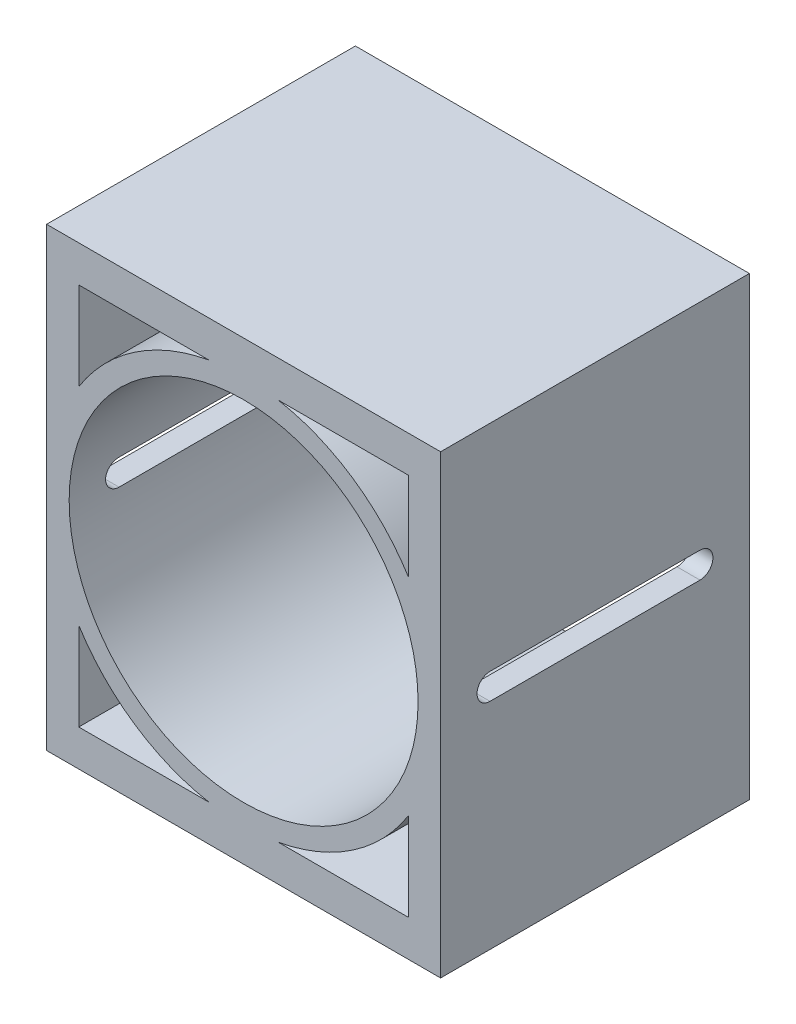
ISO-10303-21;
HEADER;
FILE_DESCRIPTION(('STEP AP214'),'2;1');
FILE_NAME('part.step','',(''),(''),'','','');
FILE_SCHEMA(('AUTOMOTIVE_DESIGN { 1 0 10303 214 1 1 1 1 }'));
ENDSEC;
DATA;
#1=APPLICATION_CONTEXT('core data for automotive mechanical design processes');
#2=APPLICATION_PROTOCOL_DEFINITION('international standard','automotive_design',2000,#1);
#3=PRODUCT_CONTEXT('',#1,'mechanical');
#4=PRODUCT('Part','Part','',(#3));
#5=PRODUCT_RELATED_PRODUCT_CATEGORY('part','',(#4));
#6=PRODUCT_DEFINITION_FORMATION('','',#4);
#7=PRODUCT_DEFINITION_CONTEXT('part definition',#1,'design');
#8=PRODUCT_DEFINITION('design','',#6,#7);
#9=PRODUCT_DEFINITION_SHAPE('','',#8);
#10=(LENGTH_UNIT() NAMED_UNIT(*) SI_UNIT(.MILLI.,.METRE.));
#11=(NAMED_UNIT(*) PLANE_ANGLE_UNIT() SI_UNIT($,.RADIAN.));
#12=(NAMED_UNIT(*) SI_UNIT($,.STERADIAN.) SOLID_ANGLE_UNIT());
#13=UNCERTAINTY_MEASURE_WITH_UNIT(LENGTH_MEASURE(1.E-05),#10,'distance_accuracy_value','');
#14=(GEOMETRIC_REPRESENTATION_CONTEXT(3) GLOBAL_UNCERTAINTY_ASSIGNED_CONTEXT((#13)) GLOBAL_UNIT_ASSIGNED_CONTEXT((#10,
#11,#12)) REPRESENTATION_CONTEXT('',''));
#15=CARTESIAN_POINT('',(0.,0.,0.));
#16=DIRECTION('',(0.,0.,1.));
#17=DIRECTION('',(1.,0.,0.));
#18=AXIS2_PLACEMENT_3D('',#15,#16,#17);
#19=CARTESIAN_POINT('',(0.,31.,10.));
#20=DIRECTION('',(0.,1.,0.));
#21=DIRECTION('',(0.,0.,1.));
#22=AXIS2_PLACEMENT_3D('',#19,#20,#21);
#23=PLANE('',#22);
#24=DIRECTION('',(1.,0.,0.));
#25=VECTOR('',#24,1.);
#26=CARTESIAN_POINT('',(0.,31.,0.));
#27=LINE('',#26,#25);
#28=CARTESIAN_POINT('',(-26.6944444444445,31.,0.));
#29=VERTEX_POINT('',#28);
#30=CARTESIAN_POINT('',(-5.59016994374946,31.,0.));
#31=VERTEX_POINT('',#30);
#32=EDGE_CURVE('E364',#29,#31,#27,.T.);
#33=ORIENTED_EDGE('',*,*,#32,.T.);
#34=DIRECTION('',(0.,0.,-1.));
#35=VECTOR('',#34,1.);
#36=CARTESIAN_POINT('',(-5.59016994374946,31.,10.));
#37=LINE('',#36,#35);
#38=CARTESIAN_POINT('',(-5.59016994374946,31.,50.));
#39=VERTEX_POINT('',#38);
#40=EDGE_CURVE('E384',#39,#31,#37,.T.);
#41=ORIENTED_EDGE('',*,*,#40,.F.);
#42=DIRECTION('',(-1.,0.,0.));
#43=VECTOR('',#42,1.);
#44=CARTESIAN_POINT('',(-26.6944444444445,31.,50.));
#45=LINE('',#44,#43);
#46=CARTESIAN_POINT('',(-26.6944444444445,31.,50.));
#47=VERTEX_POINT('',#46);
#48=EDGE_CURVE('E262',#39,#47,#45,.T.);
#49=ORIENTED_EDGE('',*,*,#48,.T.);
#50=DIRECTION('',(0.,0.,-1.));
#51=VECTOR('',#50,1.);
#52=CARTESIAN_POINT('',(-26.6944444444445,31.,10.));
#53=LINE('',#52,#51);
#54=EDGE_CURVE('E377',#47,#29,#53,.T.);
#55=ORIENTED_EDGE('',*,*,#54,.T.);
#56=EDGE_LOOP('',(#33,#41,#49,#55));
#57=FACE_BOUND('',#56,.T.);
#58=ADVANCED_FACE('F41',(#57),#23,.F.);
#59=CARTESIAN_POINT('',(0.,0.,10.));
#60=DIRECTION('',(0.,0.,-1.));
#61=DIRECTION('',(-1.,0.,0.));
#62=AXIS2_PLACEMENT_3D('',#59,#60,#61);
#63=CYLINDRICAL_SURFACE('',#62,31.5);
#64=CARTESIAN_POINT('',(0.,0.,0.));
#65=DIRECTION('',(0.,0.,1.));
#66=DIRECTION('',(1.,0.,0.));
#67=AXIS2_PLACEMENT_3D('',#64,#65,#66);
#68=CIRCLE('',#67,31.5);
#69=CARTESIAN_POINT('',(-26.6944444444445,16.7229374154922,0.));
#70=VERTEX_POINT('',#69);
#71=EDGE_CURVE('E368',#31,#70,#68,.T.);
#72=ORIENTED_EDGE('',*,*,#71,.T.);
#73=DIRECTION('',(0.,0.,-1.));
#74=VECTOR('',#73,1.);
#75=CARTESIAN_POINT('',(-26.6944444444445,16.7229374154922,10.));
#76=LINE('',#75,#74);
#77=CARTESIAN_POINT('',(-26.6944444444445,16.7229374154922,50.));
#78=VERTEX_POINT('',#77);
#79=EDGE_CURVE('E380',#78,#70,#76,.T.);
#80=ORIENTED_EDGE('',*,*,#79,.F.);
#81=CARTESIAN_POINT('',(0.,0.,50.));
#82=DIRECTION('',(0.,0.,-1.));
#83=DIRECTION('',(1.,0.,0.));
#84=AXIS2_PLACEMENT_3D('',#81,#82,#83);
#85=CIRCLE('',#84,31.5);
#86=EDGE_CURVE('E258',#78,#39,#85,.T.);
#87=ORIENTED_EDGE('',*,*,#86,.T.);
#88=ORIENTED_EDGE('',*,*,#40,.T.);
#89=EDGE_LOOP('',(#72,#80,#87,#88));
#90=FACE_BOUND('',#89,.T.);
#91=ADVANCED_FACE('F504',(#90),#63,.T.);
#92=CARTESIAN_POINT('',(0.,-31.,10.));
#93=DIRECTION('',(0.,1.,0.));
#94=DIRECTION('',(0.,0.,1.));
#95=AXIS2_PLACEMENT_3D('',#92,#93,#94);
#96=PLANE('',#95);
#97=DIRECTION('',(1.,0.,0.));
#98=VECTOR('',#97,1.);
#99=CARTESIAN_POINT('',(0.,-31.,0.));
#100=LINE('',#99,#98);
#101=CARTESIAN_POINT('',(5.59016994374955,-31.,0.));
#102=VERTEX_POINT('',#101);
#103=CARTESIAN_POINT('',(26.6944444444444,-31.,0.));
#104=VERTEX_POINT('',#103);
#105=EDGE_CURVE('E352',#102,#104,#100,.T.);
#106=ORIENTED_EDGE('',*,*,#105,.F.);
#107=DIRECTION('',(0.,0.,-1.));
#108=VECTOR('',#107,1.);
#109=CARTESIAN_POINT('',(5.59016994374955,-31.,10.));
#110=LINE('',#109,#108);
#111=CARTESIAN_POINT('',(5.59016994374955,-31.,50.));
#112=VERTEX_POINT('',#111);
#113=EDGE_CURVE('E381',#112,#102,#110,.T.);
#114=ORIENTED_EDGE('',*,*,#113,.F.);
#115=DIRECTION('',(1.,0.,0.));
#116=VECTOR('',#115,1.);
#117=CARTESIAN_POINT('',(5.59016994374955,-31.,50.));
#118=LINE('',#117,#116);
#119=CARTESIAN_POINT('',(26.6944444444444,-31.,50.));
#120=VERTEX_POINT('',#119);
#121=EDGE_CURVE('E286',#112,#120,#118,.T.);
#122=ORIENTED_EDGE('',*,*,#121,.T.);
#123=DIRECTION('',(0.,0.,-1.));
#124=VECTOR('',#123,1.);
#125=CARTESIAN_POINT('',(26.6944444444444,-31.,10.));
#126=LINE('',#125,#124);
#127=EDGE_CURVE('E389',#120,#104,#126,.T.);
#128=ORIENTED_EDGE('',*,*,#127,.T.);
#129=EDGE_LOOP('',(#106,#114,#122,#128));
#130=FACE_BOUND('',#129,.T.);
#131=ADVANCED_FACE('F507',(#130),#96,.T.);
#132=CARTESIAN_POINT('',(0.,0.,10.));
#133=DIRECTION('',(0.,0.,-1.));
#134=DIRECTION('',(-1.,0.,0.));
#135=AXIS2_PLACEMENT_3D('',#132,#133,#134);
#136=CYLINDRICAL_SURFACE('',#135,31.5);
#137=CARTESIAN_POINT('',(0.,0.,0.));
#138=DIRECTION('',(0.,0.,1.));
#139=DIRECTION('',(1.,0.,0.));
#140=AXIS2_PLACEMENT_3D('',#137,#138,#139);
#141=CIRCLE('',#140,31.5);
#142=CARTESIAN_POINT('',(26.6944444444444,-16.7229374154922,0.));
#143=VERTEX_POINT('',#142);
#144=EDGE_CURVE('E356',#102,#143,#141,.T.);
#145=ORIENTED_EDGE('',*,*,#144,.T.);
#146=DIRECTION('',(0.,0.,-1.));
#147=VECTOR('',#146,1.);
#148=CARTESIAN_POINT('',(26.6944444444444,-16.7229374154922,10.));
#149=LINE('',#148,#147);
#150=CARTESIAN_POINT('',(26.6944444444444,-16.7229374154922,50.));
#151=VERTEX_POINT('',#150);
#152=EDGE_CURVE('E392',#151,#143,#149,.T.);
#153=ORIENTED_EDGE('',*,*,#152,.F.);
#154=CARTESIAN_POINT('',(0.,0.,50.));
#155=DIRECTION('',(0.,0.,-1.));
#156=DIRECTION('',(1.,0.,0.));
#157=AXIS2_PLACEMENT_3D('',#154,#155,#156);
#158=CIRCLE('',#157,31.5);
#159=EDGE_CURVE('E282',#151,#112,#158,.T.);
#160=ORIENTED_EDGE('',*,*,#159,.T.);
#161=ORIENTED_EDGE('',*,*,#113,.T.);
#162=EDGE_LOOP('',(#145,#153,#160,#161));
#163=FACE_BOUND('',#162,.T.);
#164=ADVANCED_FACE('F517',(#163),#136,.T.);
#165=CARTESIAN_POINT('',(-26.6944444444445,0.,10.));
#166=DIRECTION('',(1.,0.,0.));
#167=DIRECTION('',(0.,0.,-1.));
#168=AXIS2_PLACEMENT_3D('',#165,#166,#167);
#169=PLANE('',#168);
#170=DIRECTION('',(0.,-1.,0.));
#171=VECTOR('',#170,1.);
#172=CARTESIAN_POINT('',(-26.6944444444445,0.,0.));
#173=LINE('',#172,#171);
#174=CARTESIAN_POINT('',(-26.6944444444445,-16.7229374154922,0.));
#175=VERTEX_POINT('',#174);
#176=CARTESIAN_POINT('',(-26.6944444444445,-31.,0.));
#177=VERTEX_POINT('',#176);
#178=EDGE_CURVE('E340',#175,#177,#173,.T.);
#179=ORIENTED_EDGE('',*,*,#178,.F.);
#180=DIRECTION('',(0.,0.,-1.));
#181=VECTOR('',#180,1.);
#182=CARTESIAN_POINT('',(-26.6944444444445,-16.7229374154922,10.));
#183=LINE('',#182,#181);
#184=CARTESIAN_POINT('',(-26.6944444444445,-16.7229374154922,50.));
#185=VERTEX_POINT('',#184);
#186=EDGE_CURVE('E393',#185,#175,#183,.T.);
#187=ORIENTED_EDGE('',*,*,#186,.F.);
#188=DIRECTION('',(0.,-1.,0.));
#189=VECTOR('',#188,1.);
#190=CARTESIAN_POINT('',(-26.6944444444445,-16.7229374154922,50.));
#191=LINE('',#190,#189);
#192=CARTESIAN_POINT('',(-26.6944444444445,-31.,50.));
#193=VERTEX_POINT('',#192);
#194=EDGE_CURVE('E270',#185,#193,#191,.T.);
#195=ORIENTED_EDGE('',*,*,#194,.T.);
#196=DIRECTION('',(0.,0.,-1.));
#197=VECTOR('',#196,1.);
#198=CARTESIAN_POINT('',(-26.6944444444445,-31.,10.));
#199=LINE('',#198,#197);
#200=EDGE_CURVE('E399',#193,#177,#199,.T.);
#201=ORIENTED_EDGE('',*,*,#200,.T.);
#202=EDGE_LOOP('',(#179,#187,#195,#201));
#203=FACE_BOUND('',#202,.T.);
#204=ADVANCED_FACE('F520',(#203),#169,.T.);
#205=CARTESIAN_POINT('',(0.,0.,10.));
#206=DIRECTION('',(0.,0.,-1.));
#207=DIRECTION('',(-1.,0.,0.));
#208=AXIS2_PLACEMENT_3D('',#205,#206,#207);
#209=CYLINDRICAL_SURFACE('',#208,31.5);
#210=CARTESIAN_POINT('',(0.,0.,0.));
#211=DIRECTION('',(0.,0.,1.));
#212=DIRECTION('',(1.,0.,0.));
#213=AXIS2_PLACEMENT_3D('',#210,#211,#212);
#214=CIRCLE('',#213,31.5);
#215=CARTESIAN_POINT('',(-5.59016994374957,-31.,0.));
#216=VERTEX_POINT('',#215);
#217=EDGE_CURVE('E344',#175,#216,#214,.T.);
#218=ORIENTED_EDGE('',*,*,#217,.T.);
#219=DIRECTION('',(0.,0.,-1.));
#220=VECTOR('',#219,1.);
#221=CARTESIAN_POINT('',(-5.59016994374957,-31.,10.));
#222=LINE('',#221,#220);
#223=CARTESIAN_POINT('',(-5.59016994374957,-31.,50.));
#224=VERTEX_POINT('',#223);
#225=EDGE_CURVE('E402',#224,#216,#222,.T.);
#226=ORIENTED_EDGE('',*,*,#225,.F.);
#227=CARTESIAN_POINT('',(0.,0.,50.));
#228=DIRECTION('',(0.,0.,-1.));
#229=DIRECTION('',(1.,0.,0.));
#230=AXIS2_PLACEMENT_3D('',#227,#228,#229);
#231=CIRCLE('',#230,31.5);
#232=EDGE_CURVE('E266',#224,#185,#231,.T.);
#233=ORIENTED_EDGE('',*,*,#232,.T.);
#234=ORIENTED_EDGE('',*,*,#186,.T.);
#235=EDGE_LOOP('',(#218,#226,#233,#234));
#236=FACE_BOUND('',#235,.T.);
#237=ADVANCED_FACE('F529',(#236),#209,.T.);
#238=CARTESIAN_POINT('',(26.6944444444444,0.,10.));
#239=DIRECTION('',(1.,0.,0.));
#240=DIRECTION('',(0.,1.,0.));
#241=AXIS2_PLACEMENT_3D('',#238,#239,#240);
#242=PLANE('',#241);
#243=DIRECTION('',(0.,-1.,0.));
#244=VECTOR('',#243,1.);
#245=CARTESIAN_POINT('',(26.6944444444444,0.,0.));
#246=LINE('',#245,#244);
#247=CARTESIAN_POINT('',(26.6944444444444,31.,0.));
#248=VERTEX_POINT('',#247);
#249=CARTESIAN_POINT('',(26.6944444444444,16.7229374154922,0.));
#250=VERTEX_POINT('',#249);
#251=EDGE_CURVE('E330',#248,#250,#246,.T.);
#252=ORIENTED_EDGE('',*,*,#251,.T.);
#253=DIRECTION('',(0.,0.,-1.));
#254=VECTOR('',#253,1.);
#255=CARTESIAN_POINT('',(26.6944444444444,16.7229374154922,10.));
#256=LINE('',#255,#254);
#257=CARTESIAN_POINT('',(26.6944444444444,16.7229374154922,50.));
#258=VERTEX_POINT('',#257);
#259=EDGE_CURVE('E403',#258,#250,#256,.T.);
#260=ORIENTED_EDGE('',*,*,#259,.F.);
#261=DIRECTION('',(0.,1.,0.));
#262=VECTOR('',#261,1.);
#263=CARTESIAN_POINT('',(26.6944444444444,31.,50.));
#264=LINE('',#263,#262);
#265=CARTESIAN_POINT('',(26.6944444444444,31.,50.));
#266=VERTEX_POINT('',#265);
#267=EDGE_CURVE('E238',#258,#266,#264,.T.);
#268=ORIENTED_EDGE('',*,*,#267,.T.);
#269=DIRECTION('',(0.,0.,-1.));
#270=VECTOR('',#269,1.);
#271=CARTESIAN_POINT('',(26.6944444444444,31.,10.));
#272=LINE('',#271,#270);
#273=EDGE_CURVE('E408',#266,#248,#272,.T.);
#274=ORIENTED_EDGE('',*,*,#273,.T.);
#275=EDGE_LOOP('',(#252,#260,#268,#274));
#276=FACE_BOUND('',#275,.T.);
#277=ADVANCED_FACE('F532',(#276),#242,.F.);
#278=CARTESIAN_POINT('',(0.,0.,10.));
#279=DIRECTION('',(0.,0.,-1.));
#280=DIRECTION('',(-1.,0.,0.));
#281=AXIS2_PLACEMENT_3D('',#278,#279,#280);
#282=CYLINDRICAL_SURFACE('',#281,31.5);
#283=CARTESIAN_POINT('',(0.,0.,0.));
#284=DIRECTION('',(0.,0.,1.));
#285=DIRECTION('',(1.,0.,0.));
#286=AXIS2_PLACEMENT_3D('',#283,#284,#285);
#287=CIRCLE('',#286,31.5);
#288=CARTESIAN_POINT('',(5.59016994374944,31.,0.));
#289=VERTEX_POINT('',#288);
#290=EDGE_CURVE('E334',#250,#289,#287,.T.);
#291=ORIENTED_EDGE('',*,*,#290,.T.);
#292=DIRECTION('',(0.,0.,-1.));
#293=VECTOR('',#292,1.);
#294=CARTESIAN_POINT('',(5.59016994374944,31.,10.));
#295=LINE('',#294,#293);
#296=CARTESIAN_POINT('',(5.59016994374944,31.,50.));
#297=VERTEX_POINT('',#296);
#298=EDGE_CURVE('E412',#297,#289,#295,.T.);
#299=ORIENTED_EDGE('',*,*,#298,.F.);
#300=CARTESIAN_POINT('',(0.,0.,50.));
#301=DIRECTION('',(0.,0.,-1.));
#302=DIRECTION('',(1.,0.,0.));
#303=AXIS2_PLACEMENT_3D('',#300,#301,#302);
#304=CIRCLE('',#303,31.5);
#305=EDGE_CURVE('E250',#297,#258,#304,.T.);
#306=ORIENTED_EDGE('',*,*,#305,.T.);
#307=ORIENTED_EDGE('',*,*,#259,.T.);
#308=EDGE_LOOP('',(#291,#299,#306,#307));
#309=FACE_BOUND('',#308,.T.);
#310=ADVANCED_FACE('F541',(#309),#282,.T.);
#311=CARTESIAN_POINT('',(31.9,0.,10.));
#312=DIRECTION('',(1.,0.,0.));
#313=DIRECTION('',(0.,1.,0.));
#314=AXIS2_PLACEMENT_3D('',#311,#312,#313);
#315=PLANE('',#314);
#316=CARTESIAN_POINT('',(31.9,0.,42.));
#317=DIRECTION('',(1.,0.,0.));
#318=DIRECTION('',(0.,1.,0.));
#319=AXIS2_PLACEMENT_3D('',#316,#317,#318);
#320=CIRCLE('',#319,2.1);
#321=CARTESIAN_POINT('',(31.9,2.1,42.));
#322=VERTEX_POINT('',#321);
#323=CARTESIAN_POINT('',(31.9,-2.1,42.));
#324=VERTEX_POINT('',#323);
#325=EDGE_CURVE('E233',#322,#324,#320,.T.);
#326=ORIENTED_EDGE('',*,*,#325,.F.);
#327=DIRECTION('',(0.,0.,1.));
#328=VECTOR('',#327,1.);
#329=CARTESIAN_POINT('',(31.9,2.1,10.));
#330=LINE('',#329,#328);
#331=CARTESIAN_POINT('',(31.9,2.1,8.));
#332=VERTEX_POINT('',#331);
#333=EDGE_CURVE('E234',#332,#322,#330,.T.);
#334=ORIENTED_EDGE('',*,*,#333,.F.);
#335=CARTESIAN_POINT('',(31.9,0.,8.));
#336=DIRECTION('',(1.,0.,0.));
#337=DIRECTION('',(0.,1.,0.));
#338=AXIS2_PLACEMENT_3D('',#335,#336,#337);
#339=CIRCLE('',#338,2.1);
#340=CARTESIAN_POINT('',(31.9,-2.1,8.));
#341=VERTEX_POINT('',#340);
#342=EDGE_CURVE('E833',#341,#332,#339,.T.);
#343=ORIENTED_EDGE('',*,*,#342,.F.);
#344=DIRECTION('',(0.,0.,-1.));
#345=VECTOR('',#344,1.);
#346=CARTESIAN_POINT('',(31.9,-2.1,10.));
#347=LINE('',#346,#345);
#348=EDGE_CURVE('E215',#324,#341,#347,.T.);
#349=ORIENTED_EDGE('',*,*,#348,.F.);
#350=EDGE_LOOP('',(#326,#334,#343,#349));
#351=FACE_BOUND('',#350,.T.);
#352=DIRECTION('',(0.,-1.,0.));
#353=VECTOR('',#352,1.);
#354=CARTESIAN_POINT('',(31.9,0.,0.));
#355=LINE('',#354,#353);
#356=CARTESIAN_POINT('',(31.9,36.9,0.));
#357=VERTEX_POINT('',#356);
#358=CARTESIAN_POINT('',(31.9,-36.9,0.));
#359=VERTEX_POINT('',#358);
#360=EDGE_CURVE('E314',#357,#359,#355,.T.);
#361=ORIENTED_EDGE('',*,*,#360,.F.);
#362=DIRECTION('',(0.,0.,-1.));
#363=VECTOR('',#362,1.);
#364=CARTESIAN_POINT('',(31.9,36.9,10.));
#365=LINE('',#364,#363);
#366=CARTESIAN_POINT('',(31.9,36.9,50.));
#367=VERTEX_POINT('',#366);
#368=EDGE_CURVE('E413',#367,#357,#365,.T.);
#369=ORIENTED_EDGE('',*,*,#368,.F.);
#370=DIRECTION('',(0.,1.,0.));
#371=VECTOR('',#370,1.);
#372=CARTESIAN_POINT('',(31.9,36.9,50.));
#373=LINE('',#372,#371);
#374=CARTESIAN_POINT('',(31.9,-36.9,50.));
#375=VERTEX_POINT('',#374);
#376=EDGE_CURVE('E294',#375,#367,#373,.T.);
#377=ORIENTED_EDGE('',*,*,#376,.F.);
#378=DIRECTION('',(0.,0.,-1.));
#379=VECTOR('',#378,1.);
#380=CARTESIAN_POINT('',(31.9,-36.9,10.));
#381=LINE('',#380,#379);
#382=EDGE_CURVE('E376',#375,#359,#381,.T.);
#383=ORIENTED_EDGE('',*,*,#382,.T.);
#384=EDGE_LOOP('',(#361,#369,#377,#383));
#385=FACE_BOUND('',#384,.T.);
#386=ADVANCED_FACE('F544',(#351,#385),#315,.T.);
#387=CARTESIAN_POINT('',(0.,36.9,10.));
#388=DIRECTION('',(0.,1.,0.));
#389=DIRECTION('',(0.,0.,1.));
#390=AXIS2_PLACEMENT_3D('',#387,#388,#389);
#391=PLANE('',#390);
#392=DIRECTION('',(1.,0.,0.));
#393=VECTOR('',#392,1.);
#394=CARTESIAN_POINT('',(0.,36.9,0.));
#395=LINE('',#394,#393);
#396=CARTESIAN_POINT('',(-31.9,36.9,0.));
#397=VERTEX_POINT('',#396);
#398=EDGE_CURVE('E318',#397,#357,#395,.T.);
#399=ORIENTED_EDGE('',*,*,#398,.F.);
#400=DIRECTION('',(0.,0.,-1.));
#401=VECTOR('',#400,1.);
#402=CARTESIAN_POINT('',(-31.9,36.9,10.));
#403=LINE('',#402,#401);
#404=CARTESIAN_POINT('',(-31.9,36.9,50.));
#405=VERTEX_POINT('',#404);
#406=EDGE_CURVE('E426',#405,#397,#403,.T.);
#407=ORIENTED_EDGE('',*,*,#406,.F.);
#408=DIRECTION('',(-1.,0.,0.));
#409=VECTOR('',#408,1.);
#410=CARTESIAN_POINT('',(-31.9,36.9,50.));
#411=LINE('',#410,#409);
#412=EDGE_CURVE('E298',#367,#405,#411,.T.);
#413=ORIENTED_EDGE('',*,*,#412,.F.);
#414=ORIENTED_EDGE('',*,*,#368,.T.);
#415=EDGE_LOOP('',(#399,#407,#413,#414));
#416=FACE_BOUND('',#415,.T.);
#417=ADVANCED_FACE('F554',(#416),#391,.T.);
#418=CARTESIAN_POINT('',(-31.9,0.,10.));
#419=DIRECTION('',(1.,0.,0.));
#420=DIRECTION('',(0.,1.,0.));
#421=AXIS2_PLACEMENT_3D('',#418,#419,#420);
#422=PLANE('',#421);
#423=DIRECTION('',(0.,0.,1.));
#424=VECTOR('',#423,1.);
#425=CARTESIAN_POINT('',(-31.9,2.1,10.));
#426=LINE('',#425,#424);
#427=CARTESIAN_POINT('',(-31.9,2.1,8.));
#428=VERTEX_POINT('',#427);
#429=CARTESIAN_POINT('',(-31.9,2.1,42.));
#430=VERTEX_POINT('',#429);
#431=EDGE_CURVE('E231',#428,#430,#426,.T.);
#432=ORIENTED_EDGE('',*,*,#431,.T.);
#433=CARTESIAN_POINT('',(-31.9,0.,42.));
#434=DIRECTION('',(1.,0.,0.));
#435=DIRECTION('',(0.,1.,0.));
#436=AXIS2_PLACEMENT_3D('',#433,#434,#435);
#437=CIRCLE('',#436,2.1);
#438=CARTESIAN_POINT('',(-31.9,-2.1,42.));
#439=VERTEX_POINT('',#438);
#440=EDGE_CURVE('E221',#430,#439,#437,.T.);
#441=ORIENTED_EDGE('',*,*,#440,.T.);
#442=DIRECTION('',(0.,0.,-1.));
#443=VECTOR('',#442,1.);
#444=CARTESIAN_POINT('',(-31.9,-2.1,10.));
#445=LINE('',#444,#443);
#446=CARTESIAN_POINT('',(-31.9,-2.1,8.));
#447=VERTEX_POINT('',#446);
#448=EDGE_CURVE('E207',#439,#447,#445,.T.);
#449=ORIENTED_EDGE('',*,*,#448,.T.);
#450=CARTESIAN_POINT('',(-31.9,0.,8.));
#451=DIRECTION('',(1.,0.,0.));
#452=DIRECTION('',(0.,1.,0.));
#453=AXIS2_PLACEMENT_3D('',#450,#451,#452);
#454=CIRCLE('',#453,2.1);
#455=EDGE_CURVE('E836',#447,#428,#454,.T.);
#456=ORIENTED_EDGE('',*,*,#455,.T.);
#457=EDGE_LOOP('',(#432,#441,#449,#456));
#458=FACE_BOUND('',#457,.T.);
#459=DIRECTION('',(0.,-1.,0.));
#460=VECTOR('',#459,1.);
#461=CARTESIAN_POINT('',(-31.9,0.,0.));
#462=LINE('',#461,#460);
#463=CARTESIAN_POINT('',(-31.9,-36.9,0.));
#464=VERTEX_POINT('',#463);
#465=EDGE_CURVE('E322',#397,#464,#462,.T.);
#466=ORIENTED_EDGE('',*,*,#465,.T.);
#467=DIRECTION('',(0.,0.,-1.));
#468=VECTOR('',#467,1.);
#469=CARTESIAN_POINT('',(-31.9,-36.9,10.));
#470=LINE('',#469,#468);
#471=CARTESIAN_POINT('',(-31.9,-36.9,50.));
#472=VERTEX_POINT('',#471);
#473=EDGE_CURVE('E422',#472,#464,#470,.T.);
#474=ORIENTED_EDGE('',*,*,#473,.F.);
#475=DIRECTION('',(0.,-1.,0.));
#476=VECTOR('',#475,1.);
#477=CARTESIAN_POINT('',(-31.9,36.9,50.));
#478=LINE('',#477,#476);
#479=EDGE_CURVE('E302',#405,#472,#478,.T.);
#480=ORIENTED_EDGE('',*,*,#479,.F.);
#481=ORIENTED_EDGE('',*,*,#406,.T.);
#482=EDGE_LOOP('',(#466,#474,#480,#481));
#483=FACE_BOUND('',#482,.T.);
#484=ADVANCED_FACE('F229',(#458,#483),#422,.F.);
#485=CARTESIAN_POINT('',(26.6944444444444,0.,10.));
#486=DIRECTION('',(1.,0.,0.));
#487=DIRECTION('',(0.,1.,0.));
#488=AXIS2_PLACEMENT_3D('',#485,#486,#487);
#489=PLANE('',#488);
#490=DIRECTION('',(0.,-1.,0.));
#491=VECTOR('',#490,1.);
#492=CARTESIAN_POINT('',(26.6944444444444,0.,0.));
#493=LINE('',#492,#491);
#494=EDGE_CURVE('E360',#143,#104,#493,.T.);
#495=ORIENTED_EDGE('',*,*,#494,.T.);
#496=ORIENTED_EDGE('',*,*,#127,.F.);
#497=DIRECTION('',(0.,1.,0.));
#498=VECTOR('',#497,1.);
#499=CARTESIAN_POINT('',(26.6944444444444,-16.7229374154922,50.));
#500=LINE('',#499,#498);
#501=EDGE_CURVE('E278',#120,#151,#500,.T.);
#502=ORIENTED_EDGE('',*,*,#501,.T.);
#503=ORIENTED_EDGE('',*,*,#152,.T.);
#504=EDGE_LOOP('',(#495,#496,#502,#503));
#505=FACE_BOUND('',#504,.T.);
#506=ADVANCED_FACE('F512',(#505),#489,.F.);
#507=CARTESIAN_POINT('',(0.,-31.,10.));
#508=DIRECTION('',(0.,1.,0.));
#509=DIRECTION('',(0.,0.,1.));
#510=AXIS2_PLACEMENT_3D('',#507,#508,#509);
#511=PLANE('',#510);
#512=DIRECTION('',(1.,0.,0.));
#513=VECTOR('',#512,1.);
#514=CARTESIAN_POINT('',(0.,-31.,0.));
#515=LINE('',#514,#513);
#516=EDGE_CURVE('E348',#177,#216,#515,.T.);
#517=ORIENTED_EDGE('',*,*,#516,.F.);
#518=ORIENTED_EDGE('',*,*,#200,.F.);
#519=DIRECTION('',(1.,0.,0.));
#520=VECTOR('',#519,1.);
#521=CARTESIAN_POINT('',(-26.6944444444445,-31.,50.));
#522=LINE('',#521,#520);
#523=EDGE_CURVE('E274',#193,#224,#522,.T.);
#524=ORIENTED_EDGE('',*,*,#523,.T.);
#525=ORIENTED_EDGE('',*,*,#225,.T.);
#526=EDGE_LOOP('',(#517,#518,#524,#525));
#527=FACE_BOUND('',#526,.T.);
#528=ADVANCED_FACE('F515',(#527),#511,.T.);
#529=CARTESIAN_POINT('',(0.,31.,10.));
#530=DIRECTION('',(0.,1.,0.));
#531=DIRECTION('',(0.,0.,1.));
#532=AXIS2_PLACEMENT_3D('',#529,#530,#531);
#533=PLANE('',#532);
#534=DIRECTION('',(1.,0.,0.));
#535=VECTOR('',#534,1.);
#536=CARTESIAN_POINT('',(0.,31.,0.));
#537=LINE('',#536,#535);
#538=EDGE_CURVE('E337',#289,#248,#537,.T.);
#539=ORIENTED_EDGE('',*,*,#538,.T.);
#540=ORIENTED_EDGE('',*,*,#273,.F.);
#541=DIRECTION('',(-1.,0.,0.));
#542=VECTOR('',#541,1.);
#543=CARTESIAN_POINT('',(5.59016994374944,31.,50.));
#544=LINE('',#543,#542);
#545=EDGE_CURVE('E246',#266,#297,#544,.T.);
#546=ORIENTED_EDGE('',*,*,#545,.T.);
#547=ORIENTED_EDGE('',*,*,#298,.T.);
#548=EDGE_LOOP('',(#539,#540,#546,#547));
#549=FACE_BOUND('',#548,.T.);
#550=ADVANCED_FACE('F527',(#549),#533,.F.);
#551=CARTESIAN_POINT('',(0.,-36.9,10.));
#552=DIRECTION('',(0.,1.,0.));
#553=DIRECTION('',(0.,0.,1.));
#554=AXIS2_PLACEMENT_3D('',#551,#552,#553);
#555=PLANE('',#554);
#556=DIRECTION('',(1.,0.,0.));
#557=VECTOR('',#556,1.);
#558=CARTESIAN_POINT('',(0.,-36.9,0.));
#559=LINE('',#558,#557);
#560=EDGE_CURVE('E326',#464,#359,#559,.T.);
#561=ORIENTED_EDGE('',*,*,#560,.T.);
#562=ORIENTED_EDGE('',*,*,#382,.F.);
#563=DIRECTION('',(1.,0.,0.));
#564=VECTOR('',#563,1.);
#565=CARTESIAN_POINT('',(-31.9,-36.9,50.));
#566=LINE('',#565,#564);
#567=EDGE_CURVE('E306',#472,#375,#566,.T.);
#568=ORIENTED_EDGE('',*,*,#567,.F.);
#569=ORIENTED_EDGE('',*,*,#473,.T.);
#570=EDGE_LOOP('',(#561,#562,#568,#569));
#571=FACE_BOUND('',#570,.T.);
#572=ADVANCED_FACE('F539',(#571),#555,.F.);
#573=CARTESIAN_POINT('',(0.,0.,10.));
#574=DIRECTION('',(0.,0.,-1.));
#575=DIRECTION('',(-1.,0.,0.));
#576=AXIS2_PLACEMENT_3D('',#573,#574,#575);
#577=CYLINDRICAL_SURFACE('',#576,28.25);
#578=CARTESIAN_POINT('',(-28.1718387756284,2.1,42.));
#579=CARTESIAN_POINT('',(-28.1718377267579,2.09999970497146,42.0589947053356));
#580=CARTESIAN_POINT('',(-28.1720243232796,2.09751245613728,42.1179610674581));
#581=CARTESIAN_POINT('',(-28.1727617151128,2.08759044515647,42.2354702627549));
#582=CARTESIAN_POINT('',(-28.1733124892594,2.08015597052626,42.2940131203419));
#583=CARTESIAN_POINT('',(-28.1754919892869,2.05050468390101,42.4682677649318));
#584=CARTESIAN_POINT('',(-28.1776479669811,2.02093979997334,42.5828097578149));
#585=CARTESIAN_POINT('',(-28.1831256315935,1.94304800963145,42.8052826973448));
#586=CARTESIAN_POINT('',(-28.1864478030427,1.89471330382971,42.9132108741522));
#587=CARTESIAN_POINT('',(-28.1938820571848,1.78066488837999,43.1194216915178));
#588=CARTESIAN_POINT('',(-28.197994017881,1.71495386221725,43.2177058182292));
#589=CARTESIAN_POINT('',(-28.2065537113043,1.56787958221924,43.4020278759789));
#590=CARTESIAN_POINT('',(-28.2110020171906,1.48648922694776,43.4880441476042));
#591=CARTESIAN_POINT('',(-28.2197284524051,1.31041239157756,43.645219540043));
#592=CARTESIAN_POINT('',(-28.2240065557393,1.21572389046087,43.7163763984656));
#593=CARTESIAN_POINT('',(-28.2319154124605,1.01561532594724,43.8418711082027));
#594=CARTESIAN_POINT('',(-28.2355454350034,0.910183354841048,43.8961900214512));
#595=CARTESIAN_POINT('',(-28.2417425992123,0.691670666663091,43.9863431328099));
#596=CARTESIAN_POINT('',(-28.2443098209243,0.578590526367849,44.0221787230611));
#597=CARTESIAN_POINT('',(-28.2480883084779,0.348207002931264,44.0742888268264));
#598=CARTESIAN_POINT('',(-28.2493020692488,0.230911803250987,44.0905993363846));
#599=CARTESIAN_POINT('',(-28.2502453224528,-0.00476023263584433,44.1033076090666));
#600=CARTESIAN_POINT('',(-28.2499748009086,-0.123137079017587,44.0997051846739));
#601=CARTESIAN_POINT('',(-28.2479819852364,-0.357361648305015,44.0727186943683));
#602=CARTESIAN_POINT('',(-28.2462625748514,-0.473213926377175,44.0493739215889));
#603=CARTESIAN_POINT('',(-28.2415687927307,-0.699350523481724,43.9836265260839));
#604=CARTESIAN_POINT('',(-28.2385944169875,-0.809634824732756,43.9412238425012));
#605=CARTESIAN_POINT('',(-28.231720418959,-1.02163314228576,43.8385192238679));
#606=CARTESIAN_POINT('',(-28.227819863737,-1.12333837601866,43.7781992253041));
#607=CARTESIAN_POINT('',(-28.2195324018492,-1.31519032272599,43.6413881453322));
#608=CARTESIAN_POINT('',(-28.2151455099825,-1.40533738723013,43.5648975559233));
#609=CARTESIAN_POINT('',(-28.2063665923354,-1.57173704899493,43.3977073584419));
#610=CARTESIAN_POINT('',(-28.2019745777616,-1.64795739562167,43.3069756520106));
#611=CARTESIAN_POINT('',(-28.1936891676311,-1.78411351385796,43.1139517056605));
#612=CARTESIAN_POINT('',(-28.1897959269494,-1.84404423380088,43.0116558934262));
#613=CARTESIAN_POINT('',(-28.1829475156879,-1.94591576160419,42.7983726296398));
#614=CARTESIAN_POINT('',(-28.1799929934745,-1.98784414236612,42.6873792364077));
#615=CARTESIAN_POINT('',(-28.1753656373618,-2.05239764645904,42.4599857425731));
#616=CARTESIAN_POINT('',(-28.1736908571087,-2.07505208941306,42.343594139236));
#617=CARTESIAN_POINT('',(-28.1724451038717,-2.09185142459871,42.1886718393157));
#618=CARTESIAN_POINT('',(-28.1722178615348,-2.09490870377655,42.1509692908941));
#619=CARTESIAN_POINT('',(-28.1719148918232,-2.09898021704317,42.0755163342956));
#620=CARTESIAN_POINT('',(-28.1718389128057,-2.09999784433037,42.0377661103254));
#621=CARTESIAN_POINT('',(-28.1718387756284,-2.1,42.));
#622=B_SPLINE_CURVE_WITH_KNOTS('',3,(#578,#579,#580,#581,#582,#583,#584,#585,#586,#587,#588,
#589,#590,#591,#592,#593,#594,#595,#596,#597,#598,#599,#600,#601,#602,#603,#604,#605,#606,#607,
#608,#609,#610,#611,#612,#613,#614,#615,#616,#617,#618,#619,#620,#621),.UNSPECIFIED.,.F.,.F.,(4,
2,2,2,2,2,2,2,2,2,2,2,2,2,2,2,2,2,2,2,2,4),(0.,0.176875153461087,0.35374002842032,
0.706865187577039,1.06013723742499,1.41335476207866,1.76718838543445,2.12107584182247,
2.47535989225241,2.82961725454794,3.18322050433557,3.53682708394556,3.88973153334457,
4.24263710967405,4.59589968572894,4.94915151511891,5.30321129279774,5.65738074497017,
6.0117942904185,6.36566773105322,6.47910939996145,6.59236218827866),.UNSPECIFIED.);
#623=CARTESIAN_POINT('',(-28.1718387756284,2.1,42.));
#624=VERTEX_POINT('',#623);
#625=CARTESIAN_POINT('',(-28.1718387756284,-2.1,42.));
#626=VERTEX_POINT('',#625);
#627=EDGE_CURVE('E11',#624,#626,#622,.T.);
#628=ORIENTED_EDGE('',*,*,#627,.F.);
#629=DIRECTION('',(0.,0.,-1.));
#630=VECTOR('',#629,1.);
#631=CARTESIAN_POINT('',(-28.1718387756284,2.1,10.));
#632=LINE('',#631,#630);
#633=CARTESIAN_POINT('',(-28.1718387756284,2.1,8.));
#634=VERTEX_POINT('',#633);
#635=EDGE_CURVE('E56',#634,#624,#632,.F.);
#636=ORIENTED_EDGE('',*,*,#635,.F.);
#637=CARTESIAN_POINT('',(-28.1718387756284,-2.1,8.));
#638=CARTESIAN_POINT('',(-28.1718377267579,-2.09999970497146,7.94100529466441));
#639=CARTESIAN_POINT('',(-28.1720243232796,-2.09751245613728,7.88203893254189));
#640=CARTESIAN_POINT('',(-28.1727617151128,-2.08759044515647,7.76452973724515));
#641=CARTESIAN_POINT('',(-28.1733124892594,-2.08015597052626,7.70598687965809));
#642=CARTESIAN_POINT('',(-28.1754919892868,-2.05050468390101,7.53173223506821));
#643=CARTESIAN_POINT('',(-28.1776479669811,-2.02093979997334,7.41719024218508));
#644=CARTESIAN_POINT('',(-28.1831256315935,-1.94304800963144,7.19471730265516));
#645=CARTESIAN_POINT('',(-28.1864478030427,-1.8947133038297,7.08678912584775));
#646=CARTESIAN_POINT('',(-28.1938820571848,-1.78066488837999,6.88057830848224));
#647=CARTESIAN_POINT('',(-28.197994017881,-1.71495386221724,6.78229418177075));
#648=CARTESIAN_POINT('',(-28.2065537113043,-1.56787958221924,6.59797212402111));
#649=CARTESIAN_POINT('',(-28.2110020171906,-1.48648922694776,6.51195585239578));
#650=CARTESIAN_POINT('',(-28.2197284524051,-1.31041239157755,6.35478045995695));
#651=CARTESIAN_POINT('',(-28.2240065557393,-1.21572389046086,6.28362360153437));
#652=CARTESIAN_POINT('',(-28.2319154124605,-1.01561532594724,6.1581288917973));
#653=CARTESIAN_POINT('',(-28.2355454350033,-0.910183354841043,6.10380997854876));
#654=CARTESIAN_POINT('',(-28.2417425992123,-0.691670666663089,6.01365686719008));
#655=CARTESIAN_POINT('',(-28.2443098209243,-0.578590526367848,5.97782127693894));
#656=CARTESIAN_POINT('',(-28.2480883084779,-0.348207002931265,5.92571117317362));
#657=CARTESIAN_POINT('',(-28.2493020692488,-0.230911803250988,5.90940066361536));
#658=CARTESIAN_POINT('',(-28.2502453224528,0.0047602326358441,5.89669239093337));
#659=CARTESIAN_POINT('',(-28.2499748009086,0.123137079017587,5.90029481532608));
#660=CARTESIAN_POINT('',(-28.2479819852364,0.357361648305015,5.92728130563168));
#661=CARTESIAN_POINT('',(-28.2462625748514,0.473213926377176,5.95062607841113));
#662=CARTESIAN_POINT('',(-28.2415687927307,0.699350523481725,6.01637347391606));
#663=CARTESIAN_POINT('',(-28.2385944169875,0.809634824732756,6.05877615749877));
#664=CARTESIAN_POINT('',(-28.231720418959,1.02163314228576,6.16148077613213));
#665=CARTESIAN_POINT('',(-28.227819863737,1.12333837601867,6.22180077469588));
#666=CARTESIAN_POINT('',(-28.2195324018492,1.31519032272599,6.35861185466781));
#667=CARTESIAN_POINT('',(-28.2151455099825,1.40533738723013,6.43510244407673));
#668=CARTESIAN_POINT('',(-28.2063665923355,1.57173704899492,6.60229264155809));
#669=CARTESIAN_POINT('',(-28.2019745777616,1.64795739562167,6.69302434798936));
#670=CARTESIAN_POINT('',(-28.1936891676311,1.78411351385795,6.8860482943395));
#671=CARTESIAN_POINT('',(-28.1897959269494,1.84404423380088,6.98834410657384));
#672=CARTESIAN_POINT('',(-28.1829475156879,1.94591576160419,7.20162737036016));
#673=CARTESIAN_POINT('',(-28.1799929934745,1.98784414236611,7.31262076359229));
#674=CARTESIAN_POINT('',(-28.1753656373618,2.05239764645903,7.54001425742685));
#675=CARTESIAN_POINT('',(-28.1736908571087,2.07505208941305,7.65640586076404));
#676=CARTESIAN_POINT('',(-28.1724451038717,2.09185142459871,7.8113281606843));
#677=CARTESIAN_POINT('',(-28.1722178615348,2.09490870377655,7.8490307091059));
#678=CARTESIAN_POINT('',(-28.1719148918232,2.09898021704317,7.92448366570441));
#679=CARTESIAN_POINT('',(-28.1718389128057,2.09999784433037,7.96223388967457));
#680=CARTESIAN_POINT('',(-28.1718387756284,2.1,8.));
#681=B_SPLINE_CURVE_WITH_KNOTS('',3,(#637,#638,#639,#640,#641,#642,#643,#644,#645,#646,#647,
#648,#649,#650,#651,#652,#653,#654,#655,#656,#657,#658,#659,#660,#661,#662,#663,#664,#665,#666,
#667,#668,#669,#670,#671,#672,#673,#674,#675,#676,#677,#678,#679,#680),.UNSPECIFIED.,.F.,.F.,(4,
2,2,2,2,2,2,2,2,2,2,2,2,2,2,2,2,2,2,2,2,4),(0.,0.176875153461085,0.353740028420315,
0.706865187577038,1.06013723742498,1.41335476207866,1.76718838543446,2.12107584182246,
2.47535989225241,2.82961725454793,3.18322050433556,3.53682708394555,3.88973153334456,
4.24263710967404,4.59589968572893,4.9491515151189,5.30321129279773,5.65738074497015,
6.01179429041848,6.3656677310532,6.47910939996143,6.59236218827865),.UNSPECIFIED.);
#682=CARTESIAN_POINT('',(-28.1718387756284,-2.1,8.));
#683=VERTEX_POINT('',#682);
#684=EDGE_CURVE('E455',#683,#634,#681,.T.);
#685=ORIENTED_EDGE('',*,*,#684,.F.);
#686=DIRECTION('',(0.,0.,-1.));
#687=VECTOR('',#686,1.);
#688=CARTESIAN_POINT('',(-28.1718387756284,-2.1,10.));
#689=LINE('',#688,#687);
#690=EDGE_CURVE('E462',#626,#683,#689,.T.);
#691=ORIENTED_EDGE('',*,*,#690,.F.);
#692=EDGE_LOOP('',(#628,#636,#685,#691));
#693=FACE_BOUND('',#692,.T.);
#694=CARTESIAN_POINT('',(28.1718387756284,-2.1,42.));
#695=CARTESIAN_POINT('',(28.1718377267579,-2.09999970497146,42.0589947053356));
#696=CARTESIAN_POINT('',(28.1720243232796,-2.09751245613728,42.1179610674581));
#697=CARTESIAN_POINT('',(28.1727617151128,-2.08759044515647,42.2354702627549));
#698=CARTESIAN_POINT('',(28.1733124892594,-2.08015597052626,42.2940131203419));
#699=CARTESIAN_POINT('',(28.1754919892868,-2.05050468390101,42.4682677649318));
#700=CARTESIAN_POINT('',(28.1776479669811,-2.02093979997334,42.5828097578149));
#701=CARTESIAN_POINT('',(28.1831256315935,-1.94304800963145,42.8052826973448));
#702=CARTESIAN_POINT('',(28.1864478030427,-1.89471330382971,42.9132108741522));
#703=CARTESIAN_POINT('',(28.1938820571848,-1.78066488837999,43.1194216915178));
#704=CARTESIAN_POINT('',(28.197994017881,-1.71495386221725,43.2177058182292));
#705=CARTESIAN_POINT('',(28.2065537113043,-1.56787958221924,43.4020278759789));
#706=CARTESIAN_POINT('',(28.2110020171906,-1.48648922694776,43.4880441476042));
#707=CARTESIAN_POINT('',(28.2197284524051,-1.31041239157756,43.645219540043));
#708=CARTESIAN_POINT('',(28.2240065557393,-1.21572389046087,43.7163763984656));
#709=CARTESIAN_POINT('',(28.2319154124604,-1.01561532594724,43.8418711082027));
#710=CARTESIAN_POINT('',(28.2355454350033,-0.910183354841046,43.8961900214512));
#711=CARTESIAN_POINT('',(28.2417425992123,-0.691670666663089,43.9863431328099));
#712=CARTESIAN_POINT('',(28.2443098209243,-0.578590526367848,44.0221787230611));
#713=CARTESIAN_POINT('',(28.2480883084779,-0.348207002931264,44.0742888268264));
#714=CARTESIAN_POINT('',(28.2493020692488,-0.230911803250987,44.0905993363846));
#715=CARTESIAN_POINT('',(28.2502453224528,0.00476023263584473,44.1033076090666));
#716=CARTESIAN_POINT('',(28.2499748009086,0.123137079017588,44.0997051846739));
#717=CARTESIAN_POINT('',(28.2479819852364,0.357361648305015,44.0727186943683));
#718=CARTESIAN_POINT('',(28.2462625748514,0.473213926377176,44.0493739215889));
#719=CARTESIAN_POINT('',(28.2415687927307,0.699350523481725,43.9836265260839));
#720=CARTESIAN_POINT('',(28.2385944169874,0.809634824732757,43.9412238425012));
#721=CARTESIAN_POINT('',(28.231720418959,1.02163314228576,43.8385192238679));
#722=CARTESIAN_POINT('',(28.2278198637369,1.12333837601867,43.7781992253041));
#723=CARTESIAN_POINT('',(28.2195324018492,1.31519032272599,43.6413881453322));
#724=CARTESIAN_POINT('',(28.2151455099824,1.40533738723013,43.5648975559233));
#725=CARTESIAN_POINT('',(28.2063665923354,1.57173704899493,43.3977073584419));
#726=CARTESIAN_POINT('',(28.2019745777616,1.64795739562167,43.3069756520106));
#727=CARTESIAN_POINT('',(28.1936891676311,1.78411351385795,43.1139517056605));
#728=CARTESIAN_POINT('',(28.1897959269494,1.84404423380088,43.0116558934262));
#729=CARTESIAN_POINT('',(28.1829475156879,1.94591576160419,42.7983726296398));
#730=CARTESIAN_POINT('',(28.1799929934744,1.98784414236612,42.6873792364077));
#731=CARTESIAN_POINT('',(28.1753656373618,2.05239764645904,42.4599857425731));
#732=CARTESIAN_POINT('',(28.1736908571087,2.07505208941306,42.343594139236));
#733=CARTESIAN_POINT('',(28.1724451038717,2.09185142459871,42.1886718393157));
#734=CARTESIAN_POINT('',(28.1722178615348,2.09490870377655,42.1509692908941));
#735=CARTESIAN_POINT('',(28.1719148918232,2.09898021704317,42.0755163342956));
#736=CARTESIAN_POINT('',(28.1718389128057,2.09999784433037,42.0377661103254));
#737=CARTESIAN_POINT('',(28.1718387756284,2.1,42.));
#738=B_SPLINE_CURVE_WITH_KNOTS('',3,(#694,#695,#696,#697,#698,#699,#700,#701,#702,#703,#704,
#705,#706,#707,#708,#709,#710,#711,#712,#713,#714,#715,#716,#717,#718,#719,#720,#721,#722,#723,
#724,#725,#726,#727,#728,#729,#730,#731,#732,#733,#734,#735,#736,#737),.UNSPECIFIED.,.F.,.F.,(4,
2,2,2,2,2,2,2,2,2,2,2,2,2,2,2,2,2,2,2,2,4),(0.,0.176875153461087,0.35374002842032,
0.706865187577039,1.06013723742499,1.41335476207866,1.76718838543445,2.12107584182247,
2.47535989225241,2.82961725454794,3.18322050433557,3.53682708394556,3.88973153334457,
4.24263710967405,4.59589968572894,4.94915151511891,5.30321129279774,5.65738074497016,
6.0117942904185,6.36566773105321,6.47910939996144,6.59236218827866),.UNSPECIFIED.);
#739=CARTESIAN_POINT('',(28.1718387756284,-2.1,42.));
#740=VERTEX_POINT('',#739);
#741=CARTESIAN_POINT('',(28.1718387756284,2.1,42.));
#742=VERTEX_POINT('',#741);
#743=EDGE_CURVE('E476',#740,#742,#738,.T.);
#744=ORIENTED_EDGE('',*,*,#743,.F.);
#745=DIRECTION('',(0.,0.,-1.));
#746=VECTOR('',#745,1.);
#747=CARTESIAN_POINT('',(28.1718387756284,-2.1,10.));
#748=LINE('',#747,#746);
#749=CARTESIAN_POINT('',(28.1718387756284,-2.1,8.));
#750=VERTEX_POINT('',#749);
#751=EDGE_CURVE('E388',#750,#740,#748,.F.);
#752=ORIENTED_EDGE('',*,*,#751,.F.);
#753=CARTESIAN_POINT('',(28.1718387756284,2.1,8.));
#754=CARTESIAN_POINT('',(28.1718377267579,2.09999970497146,7.94100529466441));
#755=CARTESIAN_POINT('',(28.1720243232796,2.09751245613728,7.88203893254189));
#756=CARTESIAN_POINT('',(28.1727617151128,2.08759044515647,7.76452973724515));
#757=CARTESIAN_POINT('',(28.1733124892594,2.08015597052626,7.70598687965809));
#758=CARTESIAN_POINT('',(28.1754919892868,2.05050468390101,7.53173223506821));
#759=CARTESIAN_POINT('',(28.1776479669811,2.02093979997334,7.41719024218508));
#760=CARTESIAN_POINT('',(28.1831256315935,1.94304800963144,7.19471730265516));
#761=CARTESIAN_POINT('',(28.1864478030427,1.8947133038297,7.08678912584775));
#762=CARTESIAN_POINT('',(28.1938820571848,1.78066488837999,6.88057830848224));
#763=CARTESIAN_POINT('',(28.197994017881,1.71495386221724,6.78229418177075));
#764=CARTESIAN_POINT('',(28.2065537113043,1.56787958221924,6.59797212402111));
#765=CARTESIAN_POINT('',(28.2110020171906,1.48648922694776,6.51195585239578));
#766=CARTESIAN_POINT('',(28.2197284524051,1.31041239157755,6.35478045995695));
#767=CARTESIAN_POINT('',(28.2240065557393,1.21572389046086,6.28362360153437));
#768=CARTESIAN_POINT('',(28.2319154124604,1.01561532594724,6.1581288917973));
#769=CARTESIAN_POINT('',(28.2355454350033,0.910183354841043,6.10380997854876));
#770=CARTESIAN_POINT('',(28.2417425992123,0.691670666663089,6.01365686719008));
#771=CARTESIAN_POINT('',(28.2443098209243,0.578590526367849,5.97782127693894));
#772=CARTESIAN_POINT('',(28.2480883084779,0.348207002931265,5.92571117317362));
#773=CARTESIAN_POINT('',(28.2493020692488,0.230911803250988,5.90940066361536));
#774=CARTESIAN_POINT('',(28.2502453224528,-0.00476023263584409,5.89669239093337));
#775=CARTESIAN_POINT('',(28.2499748009086,-0.123137079017587,5.90029481532608));
#776=CARTESIAN_POINT('',(28.2479819852364,-0.357361648305015,5.92728130563168));
#777=CARTESIAN_POINT('',(28.2462625748514,-0.473213926377177,5.95062607841113));
#778=CARTESIAN_POINT('',(28.2415687927307,-0.699350523481725,6.01637347391606));
#779=CARTESIAN_POINT('',(28.2385944169874,-0.809634824732755,6.05877615749877));
#780=CARTESIAN_POINT('',(28.231720418959,-1.02163314228576,6.16148077613213));
#781=CARTESIAN_POINT('',(28.2278198637369,-1.12333837601867,6.22180077469588));
#782=CARTESIAN_POINT('',(28.2195324018492,-1.31519032272599,6.35861185466781));
#783=CARTESIAN_POINT('',(28.2151455099824,-1.40533738723013,6.43510244407673));
#784=CARTESIAN_POINT('',(28.2063665923354,-1.57173704899492,6.60229264155809));
#785=CARTESIAN_POINT('',(28.2019745777616,-1.64795739562167,6.69302434798936));
#786=CARTESIAN_POINT('',(28.1936891676311,-1.78411351385795,6.8860482943395));
#787=CARTESIAN_POINT('',(28.1897959269494,-1.84404423380088,6.98834410657384));
#788=CARTESIAN_POINT('',(28.1829475156879,-1.94591576160419,7.20162737036016));
#789=CARTESIAN_POINT('',(28.1799929934744,-1.98784414236611,7.31262076359229));
#790=CARTESIAN_POINT('',(28.1753656373618,-2.05239764645903,7.54001425742685));
#791=CARTESIAN_POINT('',(28.1736908571087,-2.07505208941305,7.65640586076404));
#792=CARTESIAN_POINT('',(28.1724451038717,-2.09185142459871,7.8113281606843));
#793=CARTESIAN_POINT('',(28.1722178615348,-2.09490870377655,7.8490307091059));
#794=CARTESIAN_POINT('',(28.1719148918232,-2.09898021704317,7.92448366570441));
#795=CARTESIAN_POINT('',(28.1718389128057,-2.09999784433037,7.96223388967457));
#796=CARTESIAN_POINT('',(28.1718387756284,-2.1,8.));
#797=B_SPLINE_CURVE_WITH_KNOTS('',3,(#753,#754,#755,#756,#757,#758,#759,#760,#761,#762,#763,
#764,#765,#766,#767,#768,#769,#770,#771,#772,#773,#774,#775,#776,#777,#778,#779,#780,#781,#782,
#783,#784,#785,#786,#787,#788,#789,#790,#791,#792,#793,#794,#795,#796),.UNSPECIFIED.,.F.,.F.,(4,
2,2,2,2,2,2,2,2,2,2,2,2,2,2,2,2,2,2,2,2,4),(0.,0.176875153461085,0.353740028420316,
0.706865187577038,1.06013723742498,1.41335476207866,1.76718838543446,2.12107584182246,
2.47535989225241,2.82961725454793,3.18322050433556,3.53682708394555,3.88973153334456,
4.24263710967404,4.59589968572893,4.9491515151189,5.30321129279773,5.65738074497015,
6.01179429041848,6.3656677310532,6.47910939996143,6.59236218827865),.UNSPECIFIED.);
#798=CARTESIAN_POINT('',(28.1718387756284,2.1,8.));
#799=VERTEX_POINT('',#798);
#800=EDGE_CURVE('E433',#799,#750,#797,.T.);
#801=ORIENTED_EDGE('',*,*,#800,.F.);
#802=DIRECTION('',(0.,0.,-1.));
#803=VECTOR('',#802,1.);
#804=CARTESIAN_POINT('',(28.1718387756284,2.1,10.));
#805=LINE('',#804,#803);
#806=EDGE_CURVE('E442',#742,#799,#805,.T.);
#807=ORIENTED_EDGE('',*,*,#806,.F.);
#808=EDGE_LOOP('',(#744,#752,#801,#807));
#809=FACE_BOUND('',#808,.T.);
#810=CARTESIAN_POINT('',(0.,0.,0.));
#811=DIRECTION('',(0.,0.,1.));
#812=DIRECTION('',(1.,0.,0.));
#813=AXIS2_PLACEMENT_3D('',#810,#811,#812);
#814=CIRCLE('',#813,28.25);
#815=CARTESIAN_POINT('',(28.25,0.,0.));
#816=VERTEX_POINT('',#815);
#817=EDGE_CURVE('E310',#816,#816,#814,.T.);
#818=ORIENTED_EDGE('',*,*,#817,.F.);
#819=EDGE_LOOP('',(#818));
#820=FACE_BOUND('',#819,.T.);
#821=CARTESIAN_POINT('',(0.,0.,50.));
#822=DIRECTION('',(0.,0.,1.));
#823=DIRECTION('',(1.,0.,0.));
#824=AXIS2_PLACEMENT_3D('',#821,#822,#823);
#825=CIRCLE('',#824,28.25);
#826=CARTESIAN_POINT('',(28.25,0.,50.));
#827=VERTEX_POINT('',#826);
#828=EDGE_CURVE('E290',#827,#827,#825,.T.);
#829=ORIENTED_EDGE('',*,*,#828,.T.);
#830=EDGE_LOOP('',(#829));
#831=FACE_BOUND('',#830,.T.);
#832=ADVANCED_FACE('F43',(#693,#809,#820,#831),#577,.F.);
#833=CARTESIAN_POINT('',(-26.6944444444445,0.,10.));
#834=DIRECTION('',(1.,0.,0.));
#835=DIRECTION('',(0.,0.,-1.));
#836=AXIS2_PLACEMENT_3D('',#833,#834,#835);
#837=PLANE('',#836);
#838=DIRECTION('',(0.,-1.,0.));
#839=VECTOR('',#838,1.);
#840=CARTESIAN_POINT('',(-26.6944444444445,0.,0.));
#841=LINE('',#840,#839);
#842=EDGE_CURVE('E372',#29,#70,#841,.T.);
#843=ORIENTED_EDGE('',*,*,#842,.F.);
#844=ORIENTED_EDGE('',*,*,#54,.F.);
#845=DIRECTION('',(0.,-1.,0.));
#846=VECTOR('',#845,1.);
#847=CARTESIAN_POINT('',(-26.6944444444445,31.,50.));
#848=LINE('',#847,#846);
#849=EDGE_CURVE('E254',#47,#78,#848,.T.);
#850=ORIENTED_EDGE('',*,*,#849,.T.);
#851=ORIENTED_EDGE('',*,*,#79,.T.);
#852=EDGE_LOOP('',(#843,#844,#850,#851));
#853=FACE_BOUND('',#852,.T.);
#854=ADVANCED_FACE('F499',(#853),#837,.T.);
#855=CARTESIAN_POINT('',(0.,0.,0.));
#856=DIRECTION('',(0.,0.,1.));
#857=DIRECTION('',(1.,0.,0.));
#858=AXIS2_PLACEMENT_3D('',#855,#856,#857);
#859=PLANE('',#858);
#860=ORIENTED_EDGE('',*,*,#817,.T.);
#861=EDGE_LOOP('',(#860));
#862=FACE_BOUND('',#861,.T.);
#863=ORIENTED_EDGE('',*,*,#360,.T.);
#864=ORIENTED_EDGE('',*,*,#560,.F.);
#865=ORIENTED_EDGE('',*,*,#465,.F.);
#866=ORIENTED_EDGE('',*,*,#398,.T.);
#867=EDGE_LOOP('',(#863,#864,#865,#866));
#868=FACE_BOUND('',#867,.T.);
#869=ORIENTED_EDGE('',*,*,#251,.F.);
#870=ORIENTED_EDGE('',*,*,#538,.F.);
#871=ORIENTED_EDGE('',*,*,#290,.F.);
#872=EDGE_LOOP('',(#869,#870,#871));
#873=FACE_BOUND('',#872,.T.);
#874=ORIENTED_EDGE('',*,*,#178,.T.);
#875=ORIENTED_EDGE('',*,*,#516,.T.);
#876=ORIENTED_EDGE('',*,*,#217,.F.);
#877=EDGE_LOOP('',(#874,#875,#876));
#878=FACE_BOUND('',#877,.T.);
#879=ORIENTED_EDGE('',*,*,#105,.T.);
#880=ORIENTED_EDGE('',*,*,#494,.F.);
#881=ORIENTED_EDGE('',*,*,#144,.F.);
#882=EDGE_LOOP('',(#879,#880,#881));
#883=FACE_BOUND('',#882,.T.);
#884=ORIENTED_EDGE('',*,*,#32,.F.);
#885=ORIENTED_EDGE('',*,*,#842,.T.);
#886=ORIENTED_EDGE('',*,*,#71,.F.);
#887=EDGE_LOOP('',(#884,#885,#886));
#888=FACE_BOUND('',#887,.T.);
#889=ADVANCED_FACE('F495',(#862,#868,#873,#878,#883,#888),#859,.F.);
#890=CARTESIAN_POINT('',(0.,0.,50.));
#891=DIRECTION('',(0.,0.,1.));
#892=DIRECTION('',(1.,0.,0.));
#893=AXIS2_PLACEMENT_3D('',#890,#891,#892);
#894=PLANE('',#893);
#895=ORIENTED_EDGE('',*,*,#376,.T.);
#896=ORIENTED_EDGE('',*,*,#412,.T.);
#897=ORIENTED_EDGE('',*,*,#479,.T.);
#898=ORIENTED_EDGE('',*,*,#567,.T.);
#899=EDGE_LOOP('',(#895,#896,#897,#898));
#900=FACE_BOUND('',#899,.T.);
#901=ORIENTED_EDGE('',*,*,#828,.F.);
#902=EDGE_LOOP('',(#901));
#903=FACE_BOUND('',#902,.T.);
#904=ORIENTED_EDGE('',*,*,#159,.F.);
#905=ORIENTED_EDGE('',*,*,#501,.F.);
#906=ORIENTED_EDGE('',*,*,#121,.F.);
#907=EDGE_LOOP('',(#904,#905,#906));
#908=FACE_BOUND('',#907,.T.);
#909=ORIENTED_EDGE('',*,*,#194,.F.);
#910=ORIENTED_EDGE('',*,*,#232,.F.);
#911=ORIENTED_EDGE('',*,*,#523,.F.);
#912=EDGE_LOOP('',(#909,#910,#911));
#913=FACE_BOUND('',#912,.T.);
#914=ORIENTED_EDGE('',*,*,#86,.F.);
#915=ORIENTED_EDGE('',*,*,#849,.F.);
#916=ORIENTED_EDGE('',*,*,#48,.F.);
#917=EDGE_LOOP('',(#914,#915,#916));
#918=FACE_BOUND('',#917,.T.);
#919=ORIENTED_EDGE('',*,*,#545,.F.);
#920=ORIENTED_EDGE('',*,*,#267,.F.);
#921=ORIENTED_EDGE('',*,*,#305,.F.);
#922=EDGE_LOOP('',(#919,#920,#921));
#923=FACE_BOUND('',#922,.T.);
#924=ADVANCED_FACE('F491',(#900,#903,#908,#913,#918,#923),#894,.T.);
#925=CARTESIAN_POINT('',(-60.,-2.1,42.));
#926=DIRECTION('',(0.,-1.,0.));
#927=DIRECTION('',(0.,0.,-1.));
#928=AXIS2_PLACEMENT_3D('',#925,#926,#927);
#929=PLANE('',#928);
#930=ORIENTED_EDGE('',*,*,#348,.T.);
#931=DIRECTION('',(1.,0.,0.));
#932=VECTOR('',#931,1.);
#933=CARTESIAN_POINT('',(-60.,-2.1,8.));
#934=LINE('',#933,#932);
#935=EDGE_CURVE('E226',#750,#341,#934,.T.);
#936=ORIENTED_EDGE('',*,*,#935,.F.);
#937=ORIENTED_EDGE('',*,*,#751,.T.);
#938=DIRECTION('',(1.,0.,0.));
#939=VECTOR('',#938,1.);
#940=CARTESIAN_POINT('',(-60.,-2.1,42.));
#941=LINE('',#940,#939);
#942=EDGE_CURVE('E63',#740,#324,#941,.T.);
#943=ORIENTED_EDGE('',*,*,#942,.T.);
#944=EDGE_LOOP('',(#930,#936,#937,#943));
#945=FACE_BOUND('',#944,.T.);
#946=ADVANCED_FACE('F452',(#945),#929,.F.);
#947=CARTESIAN_POINT('',(-60.,0.,8.));
#948=DIRECTION('',(1.,0.,0.));
#949=DIRECTION('',(0.,0.,-1.));
#950=AXIS2_PLACEMENT_3D('',#947,#948,#949);
#951=CYLINDRICAL_SURFACE('',#950,2.1);
#952=ORIENTED_EDGE('',*,*,#342,.T.);
#953=DIRECTION('',(1.,0.,0.));
#954=VECTOR('',#953,1.);
#955=CARTESIAN_POINT('',(-60.,2.1,8.));
#956=LINE('',#955,#954);
#957=EDGE_CURVE('E845',#799,#332,#956,.T.);
#958=ORIENTED_EDGE('',*,*,#957,.F.);
#959=ORIENTED_EDGE('',*,*,#800,.T.);
#960=ORIENTED_EDGE('',*,*,#935,.T.);
#961=EDGE_LOOP('',(#952,#958,#959,#960));
#962=FACE_BOUND('',#961,.T.);
#963=ADVANCED_FACE('F451',(#962),#951,.F.);
#964=CARTESIAN_POINT('',(-60.,2.1,42.));
#965=DIRECTION('',(0.,1.,0.));
#966=DIRECTION('',(0.,0.,1.));
#967=AXIS2_PLACEMENT_3D('',#964,#965,#966);
#968=PLANE('',#967);
#969=ORIENTED_EDGE('',*,*,#333,.T.);
#970=DIRECTION('',(1.,0.,0.));
#971=VECTOR('',#970,1.);
#972=CARTESIAN_POINT('',(-60.,2.1,42.));
#973=LINE('',#972,#971);
#974=EDGE_CURVE('E472',#742,#322,#973,.T.);
#975=ORIENTED_EDGE('',*,*,#974,.F.);
#976=ORIENTED_EDGE('',*,*,#806,.T.);
#977=ORIENTED_EDGE('',*,*,#957,.T.);
#978=EDGE_LOOP('',(#969,#975,#976,#977));
#979=FACE_BOUND('',#978,.T.);
#980=ADVANCED_FACE('F635',(#979),#968,.F.);
#981=CARTESIAN_POINT('',(-60.,0.,42.));
#982=DIRECTION('',(1.,0.,0.));
#983=DIRECTION('',(0.,0.,-1.));
#984=AXIS2_PLACEMENT_3D('',#981,#982,#983);
#985=CYLINDRICAL_SURFACE('',#984,2.1);
#986=ORIENTED_EDGE('',*,*,#325,.T.);
#987=ORIENTED_EDGE('',*,*,#942,.F.);
#988=ORIENTED_EDGE('',*,*,#743,.T.);
#989=ORIENTED_EDGE('',*,*,#974,.T.);
#990=EDGE_LOOP('',(#986,#987,#988,#989));
#991=FACE_BOUND('',#990,.T.);
#992=ADVANCED_FACE('F490',(#991),#985,.F.);
#993=EDGE_CURVE('E216',#430,#624,#973,.T.);
#994=ORIENTED_EDGE('',*,*,#993,.T.);
#995=ORIENTED_EDGE('',*,*,#627,.T.);
#996=EDGE_CURVE('E210',#439,#626,#941,.T.);
#997=ORIENTED_EDGE('',*,*,#996,.F.);
#998=ORIENTED_EDGE('',*,*,#440,.F.);
#999=EDGE_LOOP('',(#994,#995,#997,#998));
#1000=FACE_BOUND('',#999,.T.);
#1001=ADVANCED_FACE('F220',(#1000),#985,.F.);
#1002=EDGE_CURVE('E468',#428,#634,#956,.T.);
#1003=ORIENTED_EDGE('',*,*,#1002,.T.);
#1004=ORIENTED_EDGE('',*,*,#635,.T.);
#1005=ORIENTED_EDGE('',*,*,#993,.F.);
#1006=ORIENTED_EDGE('',*,*,#431,.F.);
#1007=EDGE_LOOP('',(#1003,#1004,#1005,#1006));
#1008=FACE_BOUND('',#1007,.T.);
#1009=ADVANCED_FACE('F449',(#1008),#968,.F.);
#1010=EDGE_CURVE('E71',#447,#683,#934,.T.);
#1011=ORIENTED_EDGE('',*,*,#1010,.T.);
#1012=ORIENTED_EDGE('',*,*,#684,.T.);
#1013=ORIENTED_EDGE('',*,*,#1002,.F.);
#1014=ORIENTED_EDGE('',*,*,#455,.F.);
#1015=EDGE_LOOP('',(#1011,#1012,#1013,#1014));
#1016=FACE_BOUND('',#1015,.T.);
#1017=ADVANCED_FACE('F444',(#1016),#951,.F.);
#1018=ORIENTED_EDGE('',*,*,#996,.T.);
#1019=ORIENTED_EDGE('',*,*,#690,.T.);
#1020=ORIENTED_EDGE('',*,*,#1010,.F.);
#1021=ORIENTED_EDGE('',*,*,#448,.F.);
#1022=EDGE_LOOP('',(#1018,#1019,#1020,#1021));
#1023=FACE_BOUND('',#1022,.T.);
#1024=ADVANCED_FACE('F209',(#1023),#929,.F.);
#1025=CLOSED_SHELL('',(#58,#91,#131,#164,#204,#237,#277,#310,#386,#417,#484,#506,#528,#550,#572,
#832,#854,#889,#924,#946,#963,#980,#992,#1001,#1009,#1017,#1024));
#1026=MANIFOLD_SOLID_BREP('B2',#1025);
#1027=ADVANCED_BREP_SHAPE_REPRESENTATION('',(#18,#1026),#14);
#1028=SHAPE_DEFINITION_REPRESENTATION(#9,#1027);
ENDSEC;
END-ISO-10303-21;
